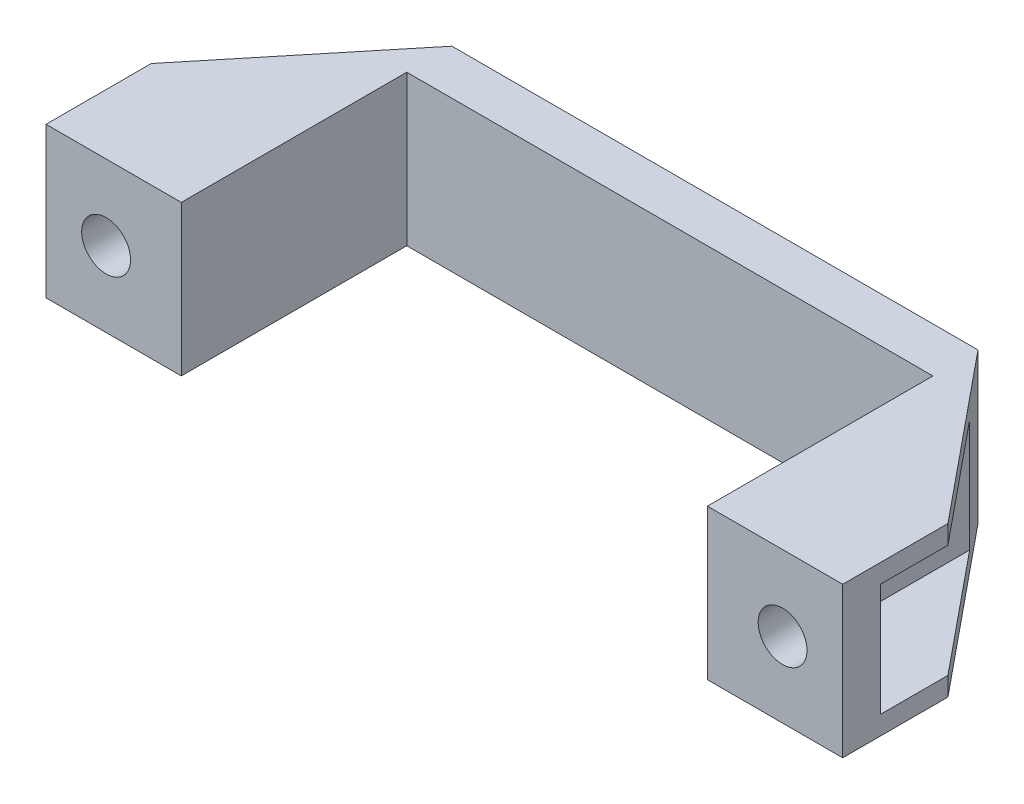
ISO-10303-21;
HEADER;
FILE_DESCRIPTION(('STEP AP214'),'2;1');
FILE_NAME('part.step','',(''),(''),'','','');
FILE_SCHEMA(('AUTOMOTIVE_DESIGN { 1 0 10303 214 1 1 1 1 }'));
ENDSEC;
DATA;
#1=APPLICATION_CONTEXT('core data for automotive mechanical design processes');
#2=APPLICATION_PROTOCOL_DEFINITION('international standard','automotive_design',2000,#1);
#3=PRODUCT_CONTEXT('',#1,'mechanical');
#4=PRODUCT('Part','Part','',(#3));
#5=PRODUCT_RELATED_PRODUCT_CATEGORY('part','',(#4));
#6=PRODUCT_DEFINITION_FORMATION('','',#4);
#7=PRODUCT_DEFINITION_CONTEXT('part definition',#1,'design');
#8=PRODUCT_DEFINITION('design','',#6,#7);
#9=PRODUCT_DEFINITION_SHAPE('','',#8);
#10=(LENGTH_UNIT() NAMED_UNIT(*) SI_UNIT(.MILLI.,.METRE.));
#11=(NAMED_UNIT(*) PLANE_ANGLE_UNIT() SI_UNIT($,.RADIAN.));
#12=(NAMED_UNIT(*) SI_UNIT($,.STERADIAN.) SOLID_ANGLE_UNIT());
#13=UNCERTAINTY_MEASURE_WITH_UNIT(LENGTH_MEASURE(1.E-05),#10,'distance_accuracy_value','');
#14=(GEOMETRIC_REPRESENTATION_CONTEXT(3) GLOBAL_UNCERTAINTY_ASSIGNED_CONTEXT((#13)) GLOBAL_UNIT_ASSIGNED_CONTEXT((#10,
#11,#12)) REPRESENTATION_CONTEXT('',''));
#15=CARTESIAN_POINT('',(0.,0.,0.));
#16=DIRECTION('',(0.,0.,1.));
#17=DIRECTION('',(1.,0.,0.));
#18=AXIS2_PLACEMENT_3D('',#15,#16,#17);
#19=CARTESIAN_POINT('',(53.,10.,0.));
#20=DIRECTION('',(-1.,0.,0.));
#21=DIRECTION('',(0.,0.,1.));
#22=AXIS2_PLACEMENT_3D('',#19,#20,#21);
#23=PLANE('',#22);
#24=DIRECTION('',(0.,0.,-1.));
#25=VECTOR('',#24,1.);
#26=CARTESIAN_POINT('',(53.,-7.5,-11.8888888888889));
#27=LINE('',#26,#25);
#28=CARTESIAN_POINT('',(53.,-7.5,13.));
#29=VERTEX_POINT('',#28);
#30=CARTESIAN_POINT('',(53.,-7.5,3.99999999999999));
#31=VERTEX_POINT('',#30);
#32=EDGE_CURVE('E174',#29,#31,#27,.T.);
#33=ORIENTED_EDGE('',*,*,#32,.F.);
#34=DIRECTION('',(0.,1.,0.));
#35=VECTOR('',#34,1.);
#36=CARTESIAN_POINT('',(53.,-7.5,13.));
#37=LINE('',#36,#35);
#38=CARTESIAN_POINT('',(53.,7.5,13.));
#39=VERTEX_POINT('',#38);
#40=EDGE_CURVE('E173',#29,#39,#37,.T.);
#41=ORIENTED_EDGE('',*,*,#40,.T.);
#42=DIRECTION('',(0.,0.,-1.));
#43=VECTOR('',#42,1.);
#44=CARTESIAN_POINT('',(53.,7.5,-11.8888888888889));
#45=LINE('',#44,#43);
#46=CARTESIAN_POINT('',(53.,7.5,3.99999999999999));
#47=VERTEX_POINT('',#46);
#48=EDGE_CURVE('E186',#39,#47,#45,.T.);
#49=ORIENTED_EDGE('',*,*,#48,.T.);
#50=DIRECTION('',(0.,-1.,0.));
#51=VECTOR('',#50,1.);
#52=CARTESIAN_POINT('',(53.,10.,4.00000000000001));
#53=LINE('',#52,#51);
#54=CARTESIAN_POINT('',(53.,10.,4.00000000000001));
#55=VERTEX_POINT('',#54);
#56=EDGE_CURVE('E302',#55,#47,#53,.T.);
#57=ORIENTED_EDGE('',*,*,#56,.F.);
#58=DIRECTION('',(0.,0.,-1.));
#59=VECTOR('',#58,1.);
#60=CARTESIAN_POINT('',(53.,10.,0.));
#61=LINE('',#60,#59);
#62=CARTESIAN_POINT('',(53.,10.,18.));
#63=VERTEX_POINT('',#62);
#64=EDGE_CURVE('E229',#63,#55,#61,.T.);
#65=ORIENTED_EDGE('',*,*,#64,.F.);
#66=DIRECTION('',(0.,-1.,0.));
#67=VECTOR('',#66,1.);
#68=CARTESIAN_POINT('',(53.,10.,18.));
#69=LINE('',#68,#67);
#70=CARTESIAN_POINT('',(53.,-10.,18.));
#71=VERTEX_POINT('',#70);
#72=EDGE_CURVE('E278',#63,#71,#69,.T.);
#73=ORIENTED_EDGE('',*,*,#72,.T.);
#74=DIRECTION('',(0.,0.,-1.));
#75=VECTOR('',#74,1.);
#76=CARTESIAN_POINT('',(53.,-10.,0.));
#77=LINE('',#76,#75);
#78=CARTESIAN_POINT('',(53.,-10.,4.00000000000001));
#79=VERTEX_POINT('',#78);
#80=EDGE_CURVE('E226',#71,#79,#77,.T.);
#81=ORIENTED_EDGE('',*,*,#80,.T.);
#82=EDGE_CURVE('E301',#31,#79,#53,.T.);
#83=ORIENTED_EDGE('',*,*,#82,.F.);
#84=EDGE_LOOP('',(#33,#41,#49,#57,#65,#73,#81,#83));
#85=FACE_BOUND('',#84,.T.);
#86=ADVANCED_FACE('F41',(#85),#23,.F.);
#87=CARTESIAN_POINT('',(29.7871287128713,10.,-24.3712871287129));
#88=DIRECTION('',(-0.773957299203321,0.,0.633237790257263));
#89=DIRECTION('',(0.633237790257263,0.,0.773957299203321));
#90=AXIS2_PLACEMENT_3D('',#87,#88,#89);
#91=PLANE('',#90);
#92=DIRECTION('',(-0.633237790257263,0.,-0.773957299203321));
#93=VECTOR('',#92,1.);
#94=CARTESIAN_POINT('',(29.7871287128713,-7.5,-24.3712871287129));
#95=LINE('',#94,#93);
#96=CARTESIAN_POINT('',(40.,-7.5,-11.8888888888889));
#97=VERTEX_POINT('',#96);
#98=EDGE_CURVE('E11',#31,#97,#95,.T.);
#99=ORIENTED_EDGE('',*,*,#98,.F.);
#100=ORIENTED_EDGE('',*,*,#82,.T.);
#101=DIRECTION('',(-0.633237790257263,0.,-0.773957299203321));
#102=VECTOR('',#101,1.);
#103=CARTESIAN_POINT('',(29.7871287128713,-10.,-24.3712871287129));
#104=LINE('',#103,#102);
#105=CARTESIAN_POINT('',(35.,-10.,-18.));
#106=VERTEX_POINT('',#105);
#107=EDGE_CURVE('E256',#79,#106,#104,.T.);
#108=ORIENTED_EDGE('',*,*,#107,.T.);
#109=DIRECTION('',(0.,-1.,0.));
#110=VECTOR('',#109,1.);
#111=CARTESIAN_POINT('',(35.,10.,-18.));
#112=LINE('',#111,#110);
#113=CARTESIAN_POINT('',(35.,10.,-18.));
#114=VERTEX_POINT('',#113);
#115=EDGE_CURVE('E299',#114,#106,#112,.T.);
#116=ORIENTED_EDGE('',*,*,#115,.F.);
#117=DIRECTION('',(-0.633237790257263,0.,-0.773957299203321));
#118=VECTOR('',#117,1.);
#119=CARTESIAN_POINT('',(29.7871287128713,10.,-24.3712871287129));
#120=LINE('',#119,#118);
#121=EDGE_CURVE('E232',#55,#114,#120,.T.);
#122=ORIENTED_EDGE('',*,*,#121,.F.);
#123=ORIENTED_EDGE('',*,*,#56,.T.);
#124=DIRECTION('',(-0.633237790257263,0.,-0.773957299203321));
#125=VECTOR('',#124,1.);
#126=CARTESIAN_POINT('',(29.7871287128713,7.5,-24.3712871287129));
#127=LINE('',#126,#125);
#128=CARTESIAN_POINT('',(40.,7.5,-11.8888888888889));
#129=VERTEX_POINT('',#128);
#130=EDGE_CURVE('E48',#47,#129,#127,.T.);
#131=ORIENTED_EDGE('',*,*,#130,.T.);
#132=DIRECTION('',(0.,1.,0.));
#133=VECTOR('',#132,1.);
#134=CARTESIAN_POINT('',(40.,-7.5,-11.8888888888889));
#135=LINE('',#134,#133);
#136=EDGE_CURVE('E196',#97,#129,#135,.T.);
#137=ORIENTED_EDGE('',*,*,#136,.F.);
#138=EDGE_LOOP('',(#99,#100,#108,#116,#122,#123,#131,#137));
#139=FACE_BOUND('',#138,.T.);
#140=ADVANCED_FACE('F315',(#139),#91,.F.);
#141=CARTESIAN_POINT('',(-29.7871287128713,10.,-24.3712871287129));
#142=DIRECTION('',(-0.773957299203321,0.,-0.633237790257263));
#143=DIRECTION('',(-0.633237790257263,0.,0.773957299203321));
#144=AXIS2_PLACEMENT_3D('',#141,#142,#143);
#145=PLANE('',#144);
#146=DIRECTION('',(0.,-1.,0.));
#147=VECTOR('',#146,1.);
#148=CARTESIAN_POINT('',(-53.,10.,4.));
#149=LINE('',#148,#147);
#150=CARTESIAN_POINT('',(-53.,-7.5,3.99999999999999));
#151=VERTEX_POINT('',#150);
#152=CARTESIAN_POINT('',(-53.,-10.,4.));
#153=VERTEX_POINT('',#152);
#154=EDGE_CURVE('E293',#151,#153,#149,.T.);
#155=ORIENTED_EDGE('',*,*,#154,.F.);
#156=DIRECTION('',(0.633237790257263,0.,-0.773957299203321));
#157=VECTOR('',#156,1.);
#158=CARTESIAN_POINT('',(-29.7871287128713,-7.5,-24.3712871287129));
#159=LINE('',#158,#157);
#160=CARTESIAN_POINT('',(-40.,-7.5,-11.8888888888889));
#161=VERTEX_POINT('',#160);
#162=EDGE_CURVE('E218',#151,#161,#159,.T.);
#163=ORIENTED_EDGE('',*,*,#162,.T.);
#164=DIRECTION('',(0.,1.,0.));
#165=VECTOR('',#164,1.);
#166=CARTESIAN_POINT('',(-40.,-7.5,-11.8888888888889));
#167=LINE('',#166,#165);
#168=CARTESIAN_POINT('',(-40.,7.5,-11.8888888888889));
#169=VERTEX_POINT('',#168);
#170=EDGE_CURVE('E194',#161,#169,#167,.T.);
#171=ORIENTED_EDGE('',*,*,#170,.T.);
#172=DIRECTION('',(0.633237790257263,0.,-0.773957299203321));
#173=VECTOR('',#172,1.);
#174=CARTESIAN_POINT('',(-29.7871287128713,7.5,-24.3712871287129));
#175=LINE('',#174,#173);
#176=CARTESIAN_POINT('',(-53.,7.5,3.99999999999999));
#177=VERTEX_POINT('',#176);
#178=EDGE_CURVE('E216',#177,#169,#175,.T.);
#179=ORIENTED_EDGE('',*,*,#178,.F.);
#180=CARTESIAN_POINT('',(-53.,10.,4.));
#181=VERTEX_POINT('',#180);
#182=EDGE_CURVE('E294',#181,#177,#149,.T.);
#183=ORIENTED_EDGE('',*,*,#182,.F.);
#184=DIRECTION('',(0.633237790257263,0.,-0.773957299203321));
#185=VECTOR('',#184,1.);
#186=CARTESIAN_POINT('',(-29.7871287128713,10.,-24.3712871287129));
#187=LINE('',#186,#185);
#188=CARTESIAN_POINT('',(-35.,10.,-18.));
#189=VERTEX_POINT('',#188);
#190=EDGE_CURVE('E238',#181,#189,#187,.T.);
#191=ORIENTED_EDGE('',*,*,#190,.T.);
#192=DIRECTION('',(0.,-1.,0.));
#193=VECTOR('',#192,1.);
#194=CARTESIAN_POINT('',(-35.,10.,-18.));
#195=LINE('',#194,#193);
#196=CARTESIAN_POINT('',(-35.,-10.,-18.));
#197=VERTEX_POINT('',#196);
#198=EDGE_CURVE('E297',#189,#197,#195,.T.);
#199=ORIENTED_EDGE('',*,*,#198,.T.);
#200=DIRECTION('',(0.633237790257263,0.,-0.773957299203321));
#201=VECTOR('',#200,1.);
#202=CARTESIAN_POINT('',(-29.7871287128713,-10.,-24.3712871287129));
#203=LINE('',#202,#201);
#204=EDGE_CURVE('E262',#153,#197,#203,.T.);
#205=ORIENTED_EDGE('',*,*,#204,.F.);
#206=EDGE_LOOP('',(#155,#163,#171,#179,#183,#191,#199,#205));
#207=FACE_BOUND('',#206,.T.);
#208=ADVANCED_FACE('F359',(#207),#145,.T.);
#209=CARTESIAN_POINT('',(-53.,10.,0.));
#210=DIRECTION('',(-1.,0.,0.));
#211=DIRECTION('',(0.,0.,1.));
#212=AXIS2_PLACEMENT_3D('',#209,#210,#211);
#213=PLANE('',#212);
#214=DIRECTION('',(0.,1.,0.));
#215=VECTOR('',#214,1.);
#216=CARTESIAN_POINT('',(-53.,-7.5,13.));
#217=LINE('',#216,#215);
#218=CARTESIAN_POINT('',(-53.,-7.5,13.));
#219=VERTEX_POINT('',#218);
#220=CARTESIAN_POINT('',(-53.,7.5,13.));
#221=VERTEX_POINT('',#220);
#222=EDGE_CURVE('E207',#219,#221,#217,.T.);
#223=ORIENTED_EDGE('',*,*,#222,.F.);
#224=DIRECTION('',(0.,0.,-1.));
#225=VECTOR('',#224,1.);
#226=CARTESIAN_POINT('',(-53.,-7.5,0.));
#227=LINE('',#226,#225);
#228=EDGE_CURVE('E311',#219,#151,#227,.T.);
#229=ORIENTED_EDGE('',*,*,#228,.T.);
#230=ORIENTED_EDGE('',*,*,#154,.T.);
#231=DIRECTION('',(0.,0.,-1.));
#232=VECTOR('',#231,1.);
#233=CARTESIAN_POINT('',(-53.,-10.,0.));
#234=LINE('',#233,#232);
#235=CARTESIAN_POINT('',(-53.,-10.,18.));
#236=VERTEX_POINT('',#235);
#237=EDGE_CURVE('E265',#236,#153,#234,.T.);
#238=ORIENTED_EDGE('',*,*,#237,.F.);
#239=DIRECTION('',(0.,-1.,0.));
#240=VECTOR('',#239,1.);
#241=CARTESIAN_POINT('',(-53.,10.,18.));
#242=LINE('',#241,#240);
#243=CARTESIAN_POINT('',(-53.,10.,18.));
#244=VERTEX_POINT('',#243);
#245=EDGE_CURVE('E291',#244,#236,#242,.T.);
#246=ORIENTED_EDGE('',*,*,#245,.F.);
#247=DIRECTION('',(0.,0.,-1.));
#248=VECTOR('',#247,1.);
#249=CARTESIAN_POINT('',(-53.,10.,0.));
#250=LINE('',#249,#248);
#251=EDGE_CURVE('E241',#244,#181,#250,.T.);
#252=ORIENTED_EDGE('',*,*,#251,.T.);
#253=ORIENTED_EDGE('',*,*,#182,.T.);
#254=DIRECTION('',(0.,0.,-1.));
#255=VECTOR('',#254,1.);
#256=CARTESIAN_POINT('',(-53.,7.5,0.));
#257=LINE('',#256,#255);
#258=EDGE_CURVE('E305',#221,#177,#257,.T.);
#259=ORIENTED_EDGE('',*,*,#258,.F.);
#260=EDGE_LOOP('',(#223,#229,#230,#238,#246,#252,#253,#259));
#261=FACE_BOUND('',#260,.T.);
#262=ADVANCED_FACE('F355',(#261),#213,.T.);
#263=CARTESIAN_POINT('',(0.,10.,-18.));
#264=DIRECTION('',(0.,0.,-1.));
#265=DIRECTION('',(-1.,0.,0.));
#266=AXIS2_PLACEMENT_3D('',#263,#264,#265);
#267=PLANE('',#266);
#268=DIRECTION('',(1.,0.,0.));
#269=VECTOR('',#268,1.);
#270=CARTESIAN_POINT('',(0.,-10.,-18.));
#271=LINE('',#270,#269);
#272=EDGE_CURVE('E259',#197,#106,#271,.T.);
#273=ORIENTED_EDGE('',*,*,#272,.F.);
#274=ORIENTED_EDGE('',*,*,#198,.F.);
#275=DIRECTION('',(1.,0.,0.));
#276=VECTOR('',#275,1.);
#277=CARTESIAN_POINT('',(0.,10.,-18.));
#278=LINE('',#277,#276);
#279=EDGE_CURVE('E235',#189,#114,#278,.T.);
#280=ORIENTED_EDGE('',*,*,#279,.T.);
#281=ORIENTED_EDGE('',*,*,#115,.T.);
#282=EDGE_LOOP('',(#273,#274,#280,#281));
#283=FACE_BOUND('',#282,.T.);
#284=ADVANCED_FACE('F363',(#283),#267,.T.);
#285=CARTESIAN_POINT('',(0.,10.,18.));
#286=DIRECTION('',(0.,0.,-1.));
#287=DIRECTION('',(-1.,0.,0.));
#288=AXIS2_PLACEMENT_3D('',#285,#286,#287);
#289=PLANE('',#288);
#290=CARTESIAN_POINT('',(-45.,0.,18.));
#291=DIRECTION('',(0.,0.,1.));
#292=DIRECTION('',(1.,0.,0.));
#293=AXIS2_PLACEMENT_3D('',#290,#291,#292);
#294=CIRCLE('',#293,3.25);
#295=CARTESIAN_POINT('',(-41.75,0.,18.));
#296=VERTEX_POINT('',#295);
#297=EDGE_CURVE('E223',#296,#296,#294,.T.);
#298=ORIENTED_EDGE('',*,*,#297,.F.);
#299=EDGE_LOOP('',(#298));
#300=FACE_BOUND('',#299,.T.);
#301=DIRECTION('',(1.,0.,0.));
#302=VECTOR('',#301,1.);
#303=CARTESIAN_POINT('',(0.,-10.,18.));
#304=LINE('',#303,#302);
#305=CARTESIAN_POINT('',(-35.,-10.,18.));
#306=VERTEX_POINT('',#305);
#307=EDGE_CURVE('E268',#236,#306,#304,.T.);
#308=ORIENTED_EDGE('',*,*,#307,.T.);
#309=DIRECTION('',(0.,-1.,0.));
#310=VECTOR('',#309,1.);
#311=CARTESIAN_POINT('',(-35.,10.,18.));
#312=LINE('',#311,#310);
#313=CARTESIAN_POINT('',(-35.,10.,18.));
#314=VERTEX_POINT('',#313);
#315=EDGE_CURVE('E288',#314,#306,#312,.T.);
#316=ORIENTED_EDGE('',*,*,#315,.F.);
#317=DIRECTION('',(1.,0.,0.));
#318=VECTOR('',#317,1.);
#319=CARTESIAN_POINT('',(0.,10.,18.));
#320=LINE('',#319,#318);
#321=EDGE_CURVE('E244',#244,#314,#320,.T.);
#322=ORIENTED_EDGE('',*,*,#321,.F.);
#323=ORIENTED_EDGE('',*,*,#245,.T.);
#324=EDGE_LOOP('',(#308,#316,#322,#323));
#325=FACE_BOUND('',#324,.T.);
#326=ADVANCED_FACE('F351',(#300,#325),#289,.F.);
#327=CARTESIAN_POINT('',(-35.,10.,0.));
#328=DIRECTION('',(-1.,0.,0.));
#329=DIRECTION('',(0.,0.,1.));
#330=AXIS2_PLACEMENT_3D('',#327,#328,#329);
#331=PLANE('',#330);
#332=DIRECTION('',(0.,0.,-1.));
#333=VECTOR('',#332,1.);
#334=CARTESIAN_POINT('',(-35.,-10.,0.));
#335=LINE('',#334,#333);
#336=CARTESIAN_POINT('',(-35.,-10.,-12.));
#337=VERTEX_POINT('',#336);
#338=EDGE_CURVE('E270',#306,#337,#335,.T.);
#339=ORIENTED_EDGE('',*,*,#338,.T.);
#340=DIRECTION('',(0.,-1.,0.));
#341=VECTOR('',#340,1.);
#342=CARTESIAN_POINT('',(-35.,10.,-12.));
#343=LINE('',#342,#341);
#344=CARTESIAN_POINT('',(-35.,10.,-12.));
#345=VERTEX_POINT('',#344);
#346=EDGE_CURVE('E285',#345,#337,#343,.T.);
#347=ORIENTED_EDGE('',*,*,#346,.F.);
#348=DIRECTION('',(0.,0.,-1.));
#349=VECTOR('',#348,1.);
#350=CARTESIAN_POINT('',(-35.,10.,0.));
#351=LINE('',#350,#349);
#352=EDGE_CURVE('E246',#314,#345,#351,.T.);
#353=ORIENTED_EDGE('',*,*,#352,.F.);
#354=ORIENTED_EDGE('',*,*,#315,.T.);
#355=EDGE_LOOP('',(#339,#347,#353,#354));
#356=FACE_BOUND('',#355,.T.);
#357=ADVANCED_FACE('F346',(#356),#331,.F.);
#358=CARTESIAN_POINT('',(0.,10.,-12.));
#359=DIRECTION('',(0.,0.,-1.));
#360=DIRECTION('',(-1.,0.,0.));
#361=AXIS2_PLACEMENT_3D('',#358,#359,#360);
#362=PLANE('',#361);
#363=DIRECTION('',(1.,0.,0.));
#364=VECTOR('',#363,1.);
#365=CARTESIAN_POINT('',(0.,-10.,-12.));
#366=LINE('',#365,#364);
#367=CARTESIAN_POINT('',(35.,-10.,-12.));
#368=VERTEX_POINT('',#367);
#369=EDGE_CURVE('E272',#337,#368,#366,.T.);
#370=ORIENTED_EDGE('',*,*,#369,.T.);
#371=DIRECTION('',(0.,-1.,0.));
#372=VECTOR('',#371,1.);
#373=CARTESIAN_POINT('',(35.,10.,-12.));
#374=LINE('',#373,#372);
#375=CARTESIAN_POINT('',(35.,10.,-12.));
#376=VERTEX_POINT('',#375);
#377=EDGE_CURVE('E283',#376,#368,#374,.T.);
#378=ORIENTED_EDGE('',*,*,#377,.F.);
#379=DIRECTION('',(1.,0.,0.));
#380=VECTOR('',#379,1.);
#381=CARTESIAN_POINT('',(0.,10.,-12.));
#382=LINE('',#381,#380);
#383=EDGE_CURVE('E249',#345,#376,#382,.T.);
#384=ORIENTED_EDGE('',*,*,#383,.F.);
#385=ORIENTED_EDGE('',*,*,#346,.T.);
#386=EDGE_LOOP('',(#370,#378,#384,#385));
#387=FACE_BOUND('',#386,.T.);
#388=ADVANCED_FACE('F340',(#387),#362,.F.);
#389=CARTESIAN_POINT('',(35.,10.,0.));
#390=DIRECTION('',(-1.,0.,0.));
#391=DIRECTION('',(0.,0.,1.));
#392=AXIS2_PLACEMENT_3D('',#389,#390,#391);
#393=PLANE('',#392);
#394=DIRECTION('',(0.,0.,-1.));
#395=VECTOR('',#394,1.);
#396=CARTESIAN_POINT('',(35.,-10.,0.));
#397=LINE('',#396,#395);
#398=CARTESIAN_POINT('',(35.,-10.,18.));
#399=VERTEX_POINT('',#398);
#400=EDGE_CURVE('E275',#399,#368,#397,.T.);
#401=ORIENTED_EDGE('',*,*,#400,.F.);
#402=DIRECTION('',(0.,-1.,0.));
#403=VECTOR('',#402,1.);
#404=CARTESIAN_POINT('',(35.,10.,18.));
#405=LINE('',#404,#403);
#406=CARTESIAN_POINT('',(35.,10.,18.));
#407=VERTEX_POINT('',#406);
#408=EDGE_CURVE('E281',#407,#399,#405,.T.);
#409=ORIENTED_EDGE('',*,*,#408,.F.);
#410=DIRECTION('',(0.,0.,-1.));
#411=VECTOR('',#410,1.);
#412=CARTESIAN_POINT('',(35.,10.,0.));
#413=LINE('',#412,#411);
#414=EDGE_CURVE('E251',#407,#376,#413,.T.);
#415=ORIENTED_EDGE('',*,*,#414,.T.);
#416=ORIENTED_EDGE('',*,*,#377,.T.);
#417=EDGE_LOOP('',(#401,#409,#415,#416));
#418=FACE_BOUND('',#417,.T.);
#419=ADVANCED_FACE('F336',(#418),#393,.T.);
#420=CARTESIAN_POINT('',(45.,0.,18.));
#421=DIRECTION('',(0.,0.,1.));
#422=DIRECTION('',(-1.,0.,0.));
#423=AXIS2_PLACEMENT_3D('',#420,#421,#422);
#424=CIRCLE('',#423,3.25);
#425=CARTESIAN_POINT('',(41.75,0.,18.));
#426=VERTEX_POINT('',#425);
#427=EDGE_CURVE('E222',#426,#426,#424,.T.);
#428=ORIENTED_EDGE('',*,*,#427,.F.);
#429=EDGE_LOOP('',(#428));
#430=FACE_BOUND('',#429,.T.);
#431=EDGE_CURVE('E233',#399,#71,#304,.T.);
#432=ORIENTED_EDGE('',*,*,#431,.T.);
#433=ORIENTED_EDGE('',*,*,#72,.F.);
#434=EDGE_CURVE('E247',#407,#63,#320,.T.);
#435=ORIENTED_EDGE('',*,*,#434,.F.);
#436=ORIENTED_EDGE('',*,*,#408,.T.);
#437=EDGE_LOOP('',(#432,#433,#435,#436));
#438=FACE_BOUND('',#437,.T.);
#439=ADVANCED_FACE('F331',(#430,#438),#289,.F.);
#440=CARTESIAN_POINT('',(0.,10.,0.));
#441=DIRECTION('',(0.,1.,0.));
#442=DIRECTION('',(0.,0.,1.));
#443=AXIS2_PLACEMENT_3D('',#440,#441,#442);
#444=PLANE('',#443);
#445=ORIENTED_EDGE('',*,*,#64,.T.);
#446=ORIENTED_EDGE('',*,*,#121,.T.);
#447=ORIENTED_EDGE('',*,*,#279,.F.);
#448=ORIENTED_EDGE('',*,*,#190,.F.);
#449=ORIENTED_EDGE('',*,*,#251,.F.);
#450=ORIENTED_EDGE('',*,*,#321,.T.);
#451=ORIENTED_EDGE('',*,*,#352,.T.);
#452=ORIENTED_EDGE('',*,*,#383,.T.);
#453=ORIENTED_EDGE('',*,*,#414,.F.);
#454=ORIENTED_EDGE('',*,*,#434,.T.);
#455=EDGE_LOOP('',(#445,#446,#447,#448,#449,#450,#451,#452,#453,#454));
#456=FACE_BOUND('',#455,.T.);
#457=ADVANCED_FACE('F365',(#456),#444,.T.);
#458=CARTESIAN_POINT('',(0.,-10.,0.));
#459=DIRECTION('',(0.,1.,0.));
#460=DIRECTION('',(0.,0.,1.));
#461=AXIS2_PLACEMENT_3D('',#458,#459,#460);
#462=PLANE('',#461);
#463=ORIENTED_EDGE('',*,*,#80,.F.);
#464=ORIENTED_EDGE('',*,*,#431,.F.);
#465=ORIENTED_EDGE('',*,*,#400,.T.);
#466=ORIENTED_EDGE('',*,*,#369,.F.);
#467=ORIENTED_EDGE('',*,*,#338,.F.);
#468=ORIENTED_EDGE('',*,*,#307,.F.);
#469=ORIENTED_EDGE('',*,*,#237,.T.);
#470=ORIENTED_EDGE('',*,*,#204,.T.);
#471=ORIENTED_EDGE('',*,*,#272,.T.);
#472=ORIENTED_EDGE('',*,*,#107,.F.);
#473=EDGE_LOOP('',(#463,#464,#465,#466,#467,#468,#469,#470,#471,#472));
#474=FACE_BOUND('',#473,.T.);
#475=ADVANCED_FACE('F325',(#474),#462,.F.);
#476=CARTESIAN_POINT('',(45.,0.,-18.));
#477=DIRECTION('',(0.,0.,1.));
#478=DIRECTION('',(1.,0.,0.));
#479=AXIS2_PLACEMENT_3D('',#476,#477,#478);
#480=CYLINDRICAL_SURFACE('',#479,3.25);
#481=CARTESIAN_POINT('',(45.,0.,13.));
#482=DIRECTION('',(0.,0.,1.));
#483=DIRECTION('',(1.,0.,0.));
#484=AXIS2_PLACEMENT_3D('',#481,#482,#483);
#485=CIRCLE('',#484,3.25);
#486=CARTESIAN_POINT('',(48.25,0.,13.));
#487=VERTEX_POINT('',#486);
#488=EDGE_CURVE('E219',#487,#487,#485,.F.);
#489=ORIENTED_EDGE('',*,*,#488,.T.);
#490=EDGE_LOOP('',(#489));
#491=FACE_BOUND('',#490,.T.);
#492=ORIENTED_EDGE('',*,*,#427,.T.);
#493=EDGE_LOOP('',(#492));
#494=FACE_BOUND('',#493,.T.);
#495=ADVANCED_FACE('F372',(#491,#494),#480,.F.);
#496=CARTESIAN_POINT('',(-45.,0.,-18.));
#497=DIRECTION('',(0.,0.,1.));
#498=DIRECTION('',(1.,0.,0.));
#499=AXIS2_PLACEMENT_3D('',#496,#497,#498);
#500=CYLINDRICAL_SURFACE('',#499,3.25);
#501=CARTESIAN_POINT('',(-45.,0.,13.));
#502=DIRECTION('',(0.,0.,1.));
#503=DIRECTION('',(1.,0.,0.));
#504=AXIS2_PLACEMENT_3D('',#501,#502,#503);
#505=CIRCLE('',#504,3.25);
#506=CARTESIAN_POINT('',(-41.75,0.,13.));
#507=VERTEX_POINT('',#506);
#508=EDGE_CURVE('E198',#507,#507,#505,.F.);
#509=ORIENTED_EDGE('',*,*,#508,.T.);
#510=EDGE_LOOP('',(#509));
#511=FACE_BOUND('',#510,.T.);
#512=ORIENTED_EDGE('',*,*,#297,.T.);
#513=EDGE_LOOP('',(#512));
#514=FACE_BOUND('',#513,.T.);
#515=ADVANCED_FACE('F432',(#511,#514),#500,.F.);
#516=CARTESIAN_POINT('',(-40.,-7.5,13.));
#517=DIRECTION('',(0.,0.,1.));
#518=DIRECTION('',(1.,0.,0.));
#519=AXIS2_PLACEMENT_3D('',#516,#517,#518);
#520=PLANE('',#519);
#521=DIRECTION('',(1.,0.,0.));
#522=VECTOR('',#521,1.);
#523=CARTESIAN_POINT('',(-40.,7.5,13.));
#524=LINE('',#523,#522);
#525=CARTESIAN_POINT('',(-40.,7.5,13.));
#526=VERTEX_POINT('',#525);
#527=EDGE_CURVE('E63',#221,#526,#524,.T.);
#528=ORIENTED_EDGE('',*,*,#527,.T.);
#529=DIRECTION('',(0.,1.,0.));
#530=VECTOR('',#529,1.);
#531=CARTESIAN_POINT('',(-40.,-7.5,13.));
#532=LINE('',#531,#530);
#533=CARTESIAN_POINT('',(-40.,-7.5,13.));
#534=VERTEX_POINT('',#533);
#535=EDGE_CURVE('E213',#534,#526,#532,.T.);
#536=ORIENTED_EDGE('',*,*,#535,.F.);
#537=DIRECTION('',(1.,0.,0.));
#538=VECTOR('',#537,1.);
#539=CARTESIAN_POINT('',(-40.,-7.5,13.));
#540=LINE('',#539,#538);
#541=EDGE_CURVE('E200',#219,#534,#540,.T.);
#542=ORIENTED_EDGE('',*,*,#541,.F.);
#543=ORIENTED_EDGE('',*,*,#222,.T.);
#544=EDGE_LOOP('',(#528,#536,#542,#543));
#545=FACE_BOUND('',#544,.T.);
#546=ORIENTED_EDGE('',*,*,#508,.F.);
#547=EDGE_LOOP('',(#546));
#548=FACE_BOUND('',#547,.T.);
#549=ADVANCED_FACE('F439',(#545,#548),#520,.F.);
#550=CARTESIAN_POINT('',(-40.,-7.5,-11.8888888888889));
#551=DIRECTION('',(1.,0.,0.));
#552=DIRECTION('',(0.,0.,-1.));
#553=AXIS2_PLACEMENT_3D('',#550,#551,#552);
#554=PLANE('',#553);
#555=DIRECTION('',(0.,0.,-1.));
#556=VECTOR('',#555,1.);
#557=CARTESIAN_POINT('',(-40.,7.5,-11.8888888888889));
#558=LINE('',#557,#556);
#559=EDGE_CURVE('E204',#526,#169,#558,.T.);
#560=ORIENTED_EDGE('',*,*,#559,.T.);
#561=ORIENTED_EDGE('',*,*,#170,.F.);
#562=DIRECTION('',(0.,0.,-1.));
#563=VECTOR('',#562,1.);
#564=CARTESIAN_POINT('',(-40.,-7.5,-11.8888888888889));
#565=LINE('',#564,#563);
#566=EDGE_CURVE('E203',#534,#161,#565,.T.);
#567=ORIENTED_EDGE('',*,*,#566,.F.);
#568=ORIENTED_EDGE('',*,*,#535,.T.);
#569=EDGE_LOOP('',(#560,#561,#567,#568));
#570=FACE_BOUND('',#569,.T.);
#571=ADVANCED_FACE('F459',(#570),#554,.F.);
#572=CARTESIAN_POINT('',(0.,-7.5,0.));
#573=DIRECTION('',(0.,1.,0.));
#574=DIRECTION('',(0.,0.,1.));
#575=AXIS2_PLACEMENT_3D('',#572,#573,#574);
#576=PLANE('',#575);
#577=ORIENTED_EDGE('',*,*,#228,.F.);
#578=ORIENTED_EDGE('',*,*,#541,.T.);
#579=ORIENTED_EDGE('',*,*,#566,.T.);
#580=ORIENTED_EDGE('',*,*,#162,.F.);
#581=EDGE_LOOP('',(#577,#578,#579,#580));
#582=FACE_BOUND('',#581,.T.);
#583=ADVANCED_FACE('F467',(#582),#576,.T.);
#584=CARTESIAN_POINT('',(0.,7.5,0.));
#585=DIRECTION('',(0.,1.,0.));
#586=DIRECTION('',(0.,0.,1.));
#587=AXIS2_PLACEMENT_3D('',#584,#585,#586);
#588=PLANE('',#587);
#589=ORIENTED_EDGE('',*,*,#178,.T.);
#590=ORIENTED_EDGE('',*,*,#559,.F.);
#591=ORIENTED_EDGE('',*,*,#527,.F.);
#592=ORIENTED_EDGE('',*,*,#258,.T.);
#593=EDGE_LOOP('',(#589,#590,#591,#592));
#594=FACE_BOUND('',#593,.T.);
#595=ADVANCED_FACE('F475',(#594),#588,.F.);
#596=CARTESIAN_POINT('',(0.,-7.5,0.));
#597=DIRECTION('',(0.,1.,0.));
#598=DIRECTION('',(0.,0.,1.));
#599=AXIS2_PLACEMENT_3D('',#596,#597,#598);
#600=PLANE('',#599);
#601=ORIENTED_EDGE('',*,*,#98,.T.);
#602=DIRECTION('',(0.,0.,1.));
#603=VECTOR('',#602,1.);
#604=CARTESIAN_POINT('',(40.,-7.5,-11.8888888888889));
#605=LINE('',#604,#603);
#606=CARTESIAN_POINT('',(40.,-7.5,13.));
#607=VERTEX_POINT('',#606);
#608=EDGE_CURVE('E169',#97,#607,#605,.T.);
#609=ORIENTED_EDGE('',*,*,#608,.T.);
#610=DIRECTION('',(1.,0.,0.));
#611=VECTOR('',#610,1.);
#612=CARTESIAN_POINT('',(40.,-7.5,13.));
#613=LINE('',#612,#611);
#614=EDGE_CURVE('E177',#607,#29,#613,.T.);
#615=ORIENTED_EDGE('',*,*,#614,.T.);
#616=ORIENTED_EDGE('',*,*,#32,.T.);
#617=EDGE_LOOP('',(#601,#609,#615,#616));
#618=FACE_BOUND('',#617,.T.);
#619=ADVANCED_FACE('F184',(#618),#600,.T.);
#620=CARTESIAN_POINT('',(0.,7.5,0.));
#621=DIRECTION('',(0.,1.,0.));
#622=DIRECTION('',(0.,0.,1.));
#623=AXIS2_PLACEMENT_3D('',#620,#621,#622);
#624=PLANE('',#623);
#625=ORIENTED_EDGE('',*,*,#48,.F.);
#626=DIRECTION('',(1.,0.,0.));
#627=VECTOR('',#626,1.);
#628=CARTESIAN_POINT('',(40.,7.5,13.));
#629=LINE('',#628,#627);
#630=CARTESIAN_POINT('',(40.,7.5,13.));
#631=VERTEX_POINT('',#630);
#632=EDGE_CURVE('E189',#631,#39,#629,.T.);
#633=ORIENTED_EDGE('',*,*,#632,.F.);
#634=DIRECTION('',(0.,0.,1.));
#635=VECTOR('',#634,1.);
#636=CARTESIAN_POINT('',(40.,7.5,-11.8888888888889));
#637=LINE('',#636,#635);
#638=EDGE_CURVE('E55',#129,#631,#637,.T.);
#639=ORIENTED_EDGE('',*,*,#638,.F.);
#640=ORIENTED_EDGE('',*,*,#130,.F.);
#641=EDGE_LOOP('',(#625,#633,#639,#640));
#642=FACE_BOUND('',#641,.T.);
#643=ADVANCED_FACE('F317',(#642),#624,.F.);
#644=CARTESIAN_POINT('',(40.,-7.5,13.));
#645=DIRECTION('',(0.,0.,1.));
#646=DIRECTION('',(1.,0.,0.));
#647=AXIS2_PLACEMENT_3D('',#644,#645,#646);
#648=PLANE('',#647);
#649=ORIENTED_EDGE('',*,*,#632,.T.);
#650=ORIENTED_EDGE('',*,*,#40,.F.);
#651=ORIENTED_EDGE('',*,*,#614,.F.);
#652=DIRECTION('',(0.,1.,0.));
#653=VECTOR('',#652,1.);
#654=CARTESIAN_POINT('',(40.,-7.5,13.));
#655=LINE('',#654,#653);
#656=EDGE_CURVE('E165',#607,#631,#655,.T.);
#657=ORIENTED_EDGE('',*,*,#656,.T.);
#658=EDGE_LOOP('',(#649,#650,#651,#657));
#659=FACE_BOUND('',#658,.T.);
#660=ORIENTED_EDGE('',*,*,#488,.F.);
#661=EDGE_LOOP('',(#660));
#662=FACE_BOUND('',#661,.T.);
#663=ADVANCED_FACE('F178',(#659,#662),#648,.F.);
#664=CARTESIAN_POINT('',(40.,-7.5,-11.8888888888889));
#665=DIRECTION('',(-1.,0.,0.));
#666=DIRECTION('',(0.,0.,1.));
#667=AXIS2_PLACEMENT_3D('',#664,#665,#666);
#668=PLANE('',#667);
#669=ORIENTED_EDGE('',*,*,#638,.T.);
#670=ORIENTED_EDGE('',*,*,#656,.F.);
#671=ORIENTED_EDGE('',*,*,#608,.F.);
#672=ORIENTED_EDGE('',*,*,#136,.T.);
#673=EDGE_LOOP('',(#669,#670,#671,#672));
#674=FACE_BOUND('',#673,.T.);
#675=ADVANCED_FACE('F167',(#674),#668,.F.);
#676=CLOSED_SHELL('',(#86,#140,#208,#262,#284,#326,#357,#388,#419,#439,#457,#475,#495,#515,#549,
#571,#583,#595,#619,#643,#663,#675));
#677=MANIFOLD_SOLID_BREP('B2',#676);
#678=ADVANCED_BREP_SHAPE_REPRESENTATION('',(#18,#677),#14);
#679=SHAPE_DEFINITION_REPRESENTATION(#9,#678);
ENDSEC;
END-ISO-10303-21;
